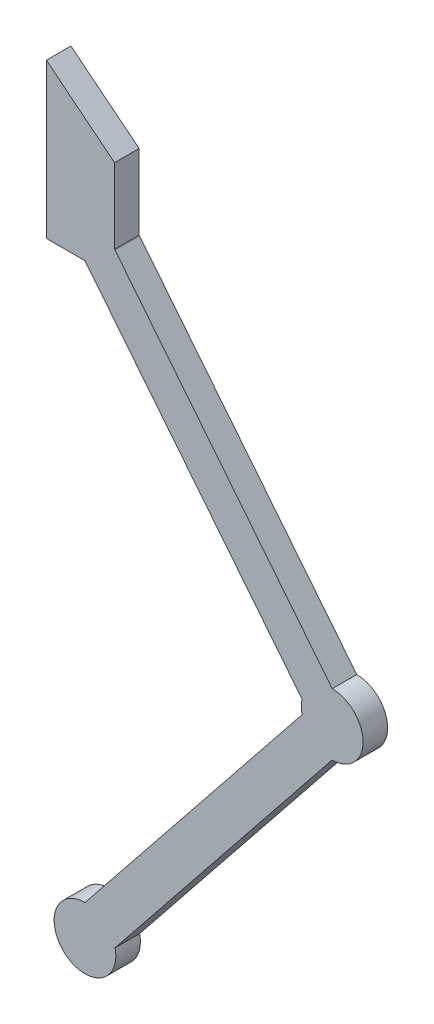
ISO-10303-21;
HEADER;
FILE_DESCRIPTION(('STEP AP214'),'2;1');
FILE_NAME('part.step','',(''),(''),'','','');
FILE_SCHEMA(('AUTOMOTIVE_DESIGN { 1 0 10303 214 1 1 1 1 }'));
ENDSEC;
DATA;
#1=APPLICATION_CONTEXT('core data for automotive mechanical design processes');
#2=APPLICATION_PROTOCOL_DEFINITION('international standard','automotive_design',2000,#1);
#3=PRODUCT_CONTEXT('',#1,'mechanical');
#4=PRODUCT('Part','Part','',(#3));
#5=PRODUCT_RELATED_PRODUCT_CATEGORY('part','',(#4));
#6=PRODUCT_DEFINITION_FORMATION('','',#4);
#7=PRODUCT_DEFINITION_CONTEXT('part definition',#1,'design');
#8=PRODUCT_DEFINITION('design','',#6,#7);
#9=PRODUCT_DEFINITION_SHAPE('','',#8);
#10=(LENGTH_UNIT() NAMED_UNIT(*) SI_UNIT(.MILLI.,.METRE.));
#11=(NAMED_UNIT(*) PLANE_ANGLE_UNIT() SI_UNIT($,.RADIAN.));
#12=(NAMED_UNIT(*) SI_UNIT($,.STERADIAN.) SOLID_ANGLE_UNIT());
#13=UNCERTAINTY_MEASURE_WITH_UNIT(LENGTH_MEASURE(1.E-05),#10,'distance_accuracy_value','');
#14=(GEOMETRIC_REPRESENTATION_CONTEXT(3) GLOBAL_UNCERTAINTY_ASSIGNED_CONTEXT((#13)) GLOBAL_UNIT_ASSIGNED_CONTEXT((#10,
#11,#12)) REPRESENTATION_CONTEXT('',''));
#15=CARTESIAN_POINT('',(0.,0.,0.));
#16=DIRECTION('',(0.,0.,1.));
#17=DIRECTION('',(1.,0.,0.));
#18=AXIS2_PLACEMENT_3D('',#15,#16,#17);
#19=CARTESIAN_POINT('',(-5.,96.0062274819819,3.18));
#20=DIRECTION('',(-0.625,-0.7806247497998,0.));
#21=DIRECTION('',(0.7806247497998,-0.625,0.));
#22=AXIS2_PLACEMENT_3D('',#19,#20,#21);
#23=PLANE('',#22);
#24=DIRECTION('',(-0.7806247497998,0.625,0.));
#25=VECTOR('',#24,1.);
#26=CARTESIAN_POINT('',(-5.,96.0062274819819,0.));
#27=LINE('',#26,#25);
#28=CARTESIAN_POINT('',(3.83821895174355,88.9299890636428,0.));
#29=VERTEX_POINT('',#28);
#30=CARTESIAN_POINT('',(-5.,96.0062274819819,0.));
#31=VERTEX_POINT('',#30);
#32=EDGE_CURVE('E153',#29,#31,#27,.T.);
#33=ORIENTED_EDGE('',*,*,#32,.T.);
#34=DIRECTION('',(0.,0.,-1.));
#35=VECTOR('',#34,1.);
#36=CARTESIAN_POINT('',(-5.,96.0062274819819,3.18));
#37=LINE('',#36,#35);
#38=CARTESIAN_POINT('',(-5.,96.0062274819819,3.18));
#39=VERTEX_POINT('',#38);
#40=EDGE_CURVE('E11',#39,#31,#37,.T.);
#41=ORIENTED_EDGE('',*,*,#40,.F.);
#42=DIRECTION('',(-0.7806247497998,0.625,0.));
#43=VECTOR('',#42,1.);
#44=CARTESIAN_POINT('',(-5.,96.0062274819819,3.18));
#45=LINE('',#44,#43);
#46=CARTESIAN_POINT('',(3.83821895174355,88.9299890636428,3.18));
#47=VERTEX_POINT('',#46);
#48=EDGE_CURVE('E175',#47,#39,#45,.T.);
#49=ORIENTED_EDGE('',*,*,#48,.F.);
#50=DIRECTION('',(0.,0.,-1.));
#51=VECTOR('',#50,1.);
#52=CARTESIAN_POINT('',(3.83821895174355,88.9299890636428,3.18));
#53=LINE('',#52,#51);
#54=EDGE_CURVE('E149',#47,#29,#53,.T.);
#55=ORIENTED_EDGE('',*,*,#54,.T.);
#56=EDGE_LOOP('',(#33,#41,#49,#55));
#57=FACE_BOUND('',#56,.T.);
#58=ADVANCED_FACE('F33',(#57),#23,.F.);
#59=CARTESIAN_POINT('',(-5.,96.0062274819819,3.18));
#60=DIRECTION('',(1.,0.,0.));
#61=DIRECTION('',(0.,0.,-1.));
#62=AXIS2_PLACEMENT_3D('',#59,#60,#61);
#63=PLANE('',#62);
#64=DIRECTION('',(0.,-1.,0.));
#65=VECTOR('',#64,1.);
#66=CARTESIAN_POINT('',(-5.,96.0062274819819,0.));
#67=LINE('',#66,#65);
#68=CARTESIAN_POINT('',(-5.,76.0062274819819,0.));
#69=VERTEX_POINT('',#68);
#70=EDGE_CURVE('E156',#31,#69,#67,.T.);
#71=ORIENTED_EDGE('',*,*,#70,.T.);
#72=DIRECTION('',(0.,0.,-1.));
#73=VECTOR('',#72,1.);
#74=CARTESIAN_POINT('',(-5.,76.0062274819819,3.18));
#75=LINE('',#74,#73);
#76=CARTESIAN_POINT('',(-5.,76.0062274819819,3.18));
#77=VERTEX_POINT('',#76);
#78=EDGE_CURVE('E41',#77,#69,#75,.T.);
#79=ORIENTED_EDGE('',*,*,#78,.F.);
#80=DIRECTION('',(0.,-1.,0.));
#81=VECTOR('',#80,1.);
#82=CARTESIAN_POINT('',(-5.,96.0062274819819,3.18));
#83=LINE('',#82,#81);
#84=EDGE_CURVE('E104',#39,#77,#83,.T.);
#85=ORIENTED_EDGE('',*,*,#84,.F.);
#86=ORIENTED_EDGE('',*,*,#40,.T.);
#87=EDGE_LOOP('',(#71,#79,#85,#86));
#88=FACE_BOUND('',#87,.T.);
#89=ADVANCED_FACE('F253',(#88),#63,.F.);
#90=CARTESIAN_POINT('',(0.,76.0062274819819,3.18));
#91=DIRECTION('',(0.,1.,0.));
#92=DIRECTION('',(0.,0.,1.));
#93=AXIS2_PLACEMENT_3D('',#90,#91,#92);
#94=PLANE('',#93);
#95=DIRECTION('',(1.,0.,0.));
#96=VECTOR('',#95,1.);
#97=CARTESIAN_POINT('',(0.,76.0062274819819,0.));
#98=LINE('',#97,#96);
#99=CARTESIAN_POINT('',(0.,76.0062274819819,0.));
#100=VERTEX_POINT('',#99);
#101=EDGE_CURVE('E158',#69,#100,#98,.T.);
#102=ORIENTED_EDGE('',*,*,#101,.T.);
#103=DIRECTION('',(0.,0.,-1.));
#104=VECTOR('',#103,1.);
#105=CARTESIAN_POINT('',(0.,76.0062274819819,3.18));
#106=LINE('',#105,#104);
#107=CARTESIAN_POINT('',(0.,76.0062274819819,3.18));
#108=VERTEX_POINT('',#107);
#109=EDGE_CURVE('E194',#108,#100,#106,.T.);
#110=ORIENTED_EDGE('',*,*,#109,.F.);
#111=DIRECTION('',(1.,0.,0.));
#112=VECTOR('',#111,1.);
#113=CARTESIAN_POINT('',(0.,76.0062274819819,3.18));
#114=LINE('',#113,#112);
#115=EDGE_CURVE('E202',#77,#108,#114,.T.);
#116=ORIENTED_EDGE('',*,*,#115,.F.);
#117=ORIENTED_EDGE('',*,*,#78,.T.);
#118=EDGE_LOOP('',(#102,#110,#116,#117));
#119=FACE_BOUND('',#118,.T.);
#120=ADVANCED_FACE('F200',(#119),#94,.F.);
#121=CARTESIAN_POINT('',(28.125,40.878113740991,3.18));
#122=DIRECTION('',(0.780624749799798,0.625000000000002,0.));
#123=DIRECTION('',(-0.625000000000002,0.780624749799798,0.));
#124=AXIS2_PLACEMENT_3D('',#121,#122,#123);
#125=PLANE('',#124);
#126=DIRECTION('',(0.625000000000002,-0.780624749799798,0.));
#127=VECTOR('',#126,1.);
#128=CARTESIAN_POINT('',(28.125,40.878113740991,0.));
#129=LINE('',#128,#127);
#130=CARTESIAN_POINT('',(28.125,40.878113740991,0.));
#131=VERTEX_POINT('',#130);
#132=EDGE_CURVE('E160',#100,#131,#129,.T.);
#133=ORIENTED_EDGE('',*,*,#132,.T.);
#134=DIRECTION('',(0.,0.,-1.));
#135=VECTOR('',#134,1.);
#136=CARTESIAN_POINT('',(28.125,40.878113740991,3.18));
#137=LINE('',#136,#135);
#138=CARTESIAN_POINT('',(28.125,40.878113740991,3.18));
#139=VERTEX_POINT('',#138);
#140=EDGE_CURVE('E191',#139,#131,#137,.T.);
#141=ORIENTED_EDGE('',*,*,#140,.F.);
#142=DIRECTION('',(0.625000000000002,-0.780624749799798,0.));
#143=VECTOR('',#142,1.);
#144=CARTESIAN_POINT('',(28.125,40.878113740991,3.18));
#145=LINE('',#144,#143);
#146=EDGE_CURVE('E220',#108,#139,#145,.T.);
#147=ORIENTED_EDGE('',*,*,#146,.F.);
#148=ORIENTED_EDGE('',*,*,#109,.T.);
#149=EDGE_LOOP('',(#133,#141,#147,#148));
#150=FACE_BOUND('',#149,.T.);
#151=ADVANCED_FACE('F211',(#150),#125,.F.);
#152=CARTESIAN_POINT('',(32.028123748999,40.003113740991,3.18));
#153=DIRECTION('',(0.,0.,-1.));
#154=DIRECTION('',(-1.,0.,0.));
#155=AXIS2_PLACEMENT_3D('',#152,#153,#154);
#156=CYLINDRICAL_SURFACE('',#155,4.00000000000002);
#157=CARTESIAN_POINT('',(32.028123748999,40.003113740991,0.));
#158=DIRECTION('',(0.,0.,1.));
#159=DIRECTION('',(-1.,0.,0.));
#160=AXIS2_PLACEMENT_3D('',#157,#158,#159);
#161=CIRCLE('',#160,4.00000000000002);
#162=CARTESIAN_POINT('',(28.125,39.128113740991,0.));
#163=VERTEX_POINT('',#162);
#164=EDGE_CURVE('E162',#131,#163,#161,.T.);
#165=ORIENTED_EDGE('',*,*,#164,.T.);
#166=DIRECTION('',(0.,0.,-1.));
#167=VECTOR('',#166,1.);
#168=CARTESIAN_POINT('',(28.125,39.128113740991,3.18));
#169=LINE('',#168,#167);
#170=CARTESIAN_POINT('',(28.125,39.128113740991,3.18));
#171=VERTEX_POINT('',#170);
#172=EDGE_CURVE('E188',#171,#163,#169,.T.);
#173=ORIENTED_EDGE('',*,*,#172,.F.);
#174=CARTESIAN_POINT('',(32.028123748999,40.003113740991,3.18));
#175=DIRECTION('',(0.,0.,1.));
#176=DIRECTION('',(-1.,0.,0.));
#177=AXIS2_PLACEMENT_3D('',#174,#175,#176);
#178=CIRCLE('',#177,4.00000000000002);
#179=EDGE_CURVE('E217',#139,#171,#178,.T.);
#180=ORIENTED_EDGE('',*,*,#179,.F.);
#181=ORIENTED_EDGE('',*,*,#140,.T.);
#182=EDGE_LOOP('',(#165,#173,#180,#181));
#183=FACE_BOUND('',#182,.T.);
#184=ADVANCED_FACE('F215',(#183),#156,.T.);
#185=CARTESIAN_POINT('',(0.,4.,3.18));
#186=DIRECTION('',(0.7806247497998,-0.625,0.));
#187=DIRECTION('',(0.625,0.7806247497998,0.));
#188=AXIS2_PLACEMENT_3D('',#185,#186,#187);
#189=PLANE('',#188);
#190=DIRECTION('',(-0.625,-0.7806247497998,0.));
#191=VECTOR('',#190,1.);
#192=CARTESIAN_POINT('',(0.,4.,0.));
#193=LINE('',#192,#191);
#194=CARTESIAN_POINT('',(0.,4.,0.));
#195=VERTEX_POINT('',#194);
#196=EDGE_CURVE('E164',#163,#195,#193,.T.);
#197=ORIENTED_EDGE('',*,*,#196,.T.);
#198=DIRECTION('',(0.,0.,-1.));
#199=VECTOR('',#198,1.);
#200=CARTESIAN_POINT('',(0.,4.,3.18));
#201=LINE('',#200,#199);
#202=CARTESIAN_POINT('',(0.,4.,3.18));
#203=VERTEX_POINT('',#202);
#204=EDGE_CURVE('E185',#203,#195,#201,.T.);
#205=ORIENTED_EDGE('',*,*,#204,.F.);
#206=DIRECTION('',(-0.625,-0.7806247497998,0.));
#207=VECTOR('',#206,1.);
#208=CARTESIAN_POINT('',(0.,4.,3.18));
#209=LINE('',#208,#207);
#210=EDGE_CURVE('E219',#171,#203,#209,.T.);
#211=ORIENTED_EDGE('',*,*,#210,.F.);
#212=ORIENTED_EDGE('',*,*,#172,.T.);
#213=EDGE_LOOP('',(#197,#205,#211,#212));
#214=FACE_BOUND('',#213,.T.);
#215=ADVANCED_FACE('F266',(#214),#189,.F.);
#216=CARTESIAN_POINT('',(0.,0.,3.18));
#217=DIRECTION('',(0.,0.,-1.));
#218=DIRECTION('',(-1.,0.,0.));
#219=AXIS2_PLACEMENT_3D('',#216,#217,#218);
#220=CYLINDRICAL_SURFACE('',#219,4.);
#221=CARTESIAN_POINT('',(0.,0.,0.));
#222=DIRECTION('',(0.,0.,1.));
#223=DIRECTION('',(1.,0.,0.));
#224=AXIS2_PLACEMENT_3D('',#221,#222,#223);
#225=CIRCLE('',#224,4.);
#226=CARTESIAN_POINT('',(3.903123748999,0.875000000000002,0.));
#227=VERTEX_POINT('',#226);
#228=EDGE_CURVE('E166',#195,#227,#225,.T.);
#229=ORIENTED_EDGE('',*,*,#228,.T.);
#230=DIRECTION('',(0.,0.,-1.));
#231=VECTOR('',#230,1.);
#232=CARTESIAN_POINT('',(3.903123748999,0.875000000000002,3.18));
#233=LINE('',#232,#231);
#234=CARTESIAN_POINT('',(3.903123748999,0.875000000000002,3.18));
#235=VERTEX_POINT('',#234);
#236=EDGE_CURVE('E182',#235,#227,#233,.T.);
#237=ORIENTED_EDGE('',*,*,#236,.F.);
#238=CARTESIAN_POINT('',(0.,0.,3.18));
#239=DIRECTION('',(0.,0.,1.));
#240=DIRECTION('',(1.,0.,0.));
#241=AXIS2_PLACEMENT_3D('',#238,#239,#240);
#242=CIRCLE('',#241,4.);
#243=EDGE_CURVE('E222',#203,#235,#242,.T.);
#244=ORIENTED_EDGE('',*,*,#243,.F.);
#245=ORIENTED_EDGE('',*,*,#204,.T.);
#246=EDGE_LOOP('',(#229,#237,#244,#245));
#247=FACE_BOUND('',#246,.T.);
#248=ADVANCED_FACE('F269',(#247),#220,.T.);
#249=CARTESIAN_POINT('',(3.903123748999,0.875000000000001,3.18));
#250=DIRECTION('',(-0.7806247497998,0.625,0.));
#251=DIRECTION('',(-0.625,-0.7806247497998,0.));
#252=AXIS2_PLACEMENT_3D('',#249,#250,#251);
#253=PLANE('',#252);
#254=DIRECTION('',(0.625,0.7806247497998,0.));
#255=VECTOR('',#254,1.);
#256=CARTESIAN_POINT('',(3.903123748999,0.875000000000001,0.));
#257=LINE('',#256,#255);
#258=CARTESIAN_POINT('',(32.028123748999,36.003113740991,0.));
#259=VERTEX_POINT('',#258);
#260=EDGE_CURVE('E168',#227,#259,#257,.T.);
#261=ORIENTED_EDGE('',*,*,#260,.T.);
#262=DIRECTION('',(0.,0.,-1.));
#263=VECTOR('',#262,1.);
#264=CARTESIAN_POINT('',(32.028123748999,36.003113740991,3.18));
#265=LINE('',#264,#263);
#266=CARTESIAN_POINT('',(32.028123748999,36.003113740991,3.18));
#267=VERTEX_POINT('',#266);
#268=EDGE_CURVE('E179',#267,#259,#265,.T.);
#269=ORIENTED_EDGE('',*,*,#268,.F.);
#270=DIRECTION('',(0.625,0.7806247497998,0.));
#271=VECTOR('',#270,1.);
#272=CARTESIAN_POINT('',(3.903123748999,0.875000000000001,3.18));
#273=LINE('',#272,#271);
#274=EDGE_CURVE('E228',#235,#267,#273,.T.);
#275=ORIENTED_EDGE('',*,*,#274,.F.);
#276=ORIENTED_EDGE('',*,*,#236,.T.);
#277=EDGE_LOOP('',(#261,#269,#275,#276));
#278=FACE_BOUND('',#277,.T.);
#279=ADVANCED_FACE('F234',(#278),#253,.F.);
#280=CARTESIAN_POINT('',(32.028123748999,40.003113740991,3.18));
#281=DIRECTION('',(0.,0.,-1.));
#282=DIRECTION('',(-1.,0.,0.));
#283=AXIS2_PLACEMENT_3D('',#280,#281,#282);
#284=CYLINDRICAL_SURFACE('',#283,3.99999999999999);
#285=CARTESIAN_POINT('',(32.028123748999,40.003113740991,0.));
#286=DIRECTION('',(0.,0.,1.));
#287=DIRECTION('',(1.,0.,0.));
#288=AXIS2_PLACEMENT_3D('',#285,#286,#287);
#289=CIRCLE('',#288,3.99999999999999);
#290=CARTESIAN_POINT('',(32.028123748999,44.003113740991,0.));
#291=VERTEX_POINT('',#290);
#292=EDGE_CURVE('E170',#259,#291,#289,.T.);
#293=ORIENTED_EDGE('',*,*,#292,.T.);
#294=DIRECTION('',(0.,0.,-1.));
#295=VECTOR('',#294,1.);
#296=CARTESIAN_POINT('',(32.028123748999,44.003113740991,3.18));
#297=LINE('',#296,#295);
#298=CARTESIAN_POINT('',(32.028123748999,44.003113740991,3.18));
#299=VERTEX_POINT('',#298);
#300=EDGE_CURVE('E144',#299,#291,#297,.T.);
#301=ORIENTED_EDGE('',*,*,#300,.F.);
#302=CARTESIAN_POINT('',(32.028123748999,40.003113740991,3.18));
#303=DIRECTION('',(0.,0.,1.));
#304=DIRECTION('',(1.,0.,0.));
#305=AXIS2_PLACEMENT_3D('',#302,#303,#304);
#306=CIRCLE('',#305,3.99999999999999);
#307=EDGE_CURVE('E135',#267,#299,#306,.T.);
#308=ORIENTED_EDGE('',*,*,#307,.F.);
#309=ORIENTED_EDGE('',*,*,#268,.T.);
#310=EDGE_LOOP('',(#293,#301,#308,#309));
#311=FACE_BOUND('',#310,.T.);
#312=ADVANCED_FACE('F238',(#311),#284,.T.);
#313=CARTESIAN_POINT('',(32.028123748999,44.003113740991,3.18));
#314=DIRECTION('',(-0.780624749799801,-0.624999999999999,0.));
#315=DIRECTION('',(0.624999999999999,-0.780624749799801,0.));
#316=AXIS2_PLACEMENT_3D('',#313,#314,#315);
#317=PLANE('',#316);
#318=DIRECTION('',(-0.624999999999999,0.780624749799801,0.));
#319=VECTOR('',#318,1.);
#320=CARTESIAN_POINT('',(32.028123748999,44.003113740991,0.));
#321=LINE('',#320,#319);
#322=CARTESIAN_POINT('',(3.90312374899906,79.131227481982,0.));
#323=VERTEX_POINT('',#322);
#324=EDGE_CURVE('E143',#291,#323,#321,.T.);
#325=ORIENTED_EDGE('',*,*,#324,.T.);
#326=DIRECTION('',(0.,0.,-1.));
#327=VECTOR('',#326,1.);
#328=CARTESIAN_POINT('',(3.90312374899906,79.131227481982,3.18));
#329=LINE('',#328,#327);
#330=CARTESIAN_POINT('',(3.90312374899906,79.131227481982,3.18));
#331=VERTEX_POINT('',#330);
#332=EDGE_CURVE('E140',#331,#323,#329,.T.);
#333=ORIENTED_EDGE('',*,*,#332,.F.);
#334=DIRECTION('',(-0.624999999999999,0.780624749799801,0.));
#335=VECTOR('',#334,1.);
#336=CARTESIAN_POINT('',(32.028123748999,44.003113740991,3.18));
#337=LINE('',#336,#335);
#338=EDGE_CURVE('E129',#299,#331,#337,.T.);
#339=ORIENTED_EDGE('',*,*,#338,.F.);
#340=ORIENTED_EDGE('',*,*,#300,.T.);
#341=EDGE_LOOP('',(#325,#333,#339,#340));
#342=FACE_BOUND('',#341,.T.);
#343=ADVANCED_FACE('F141',(#342),#317,.F.);
#344=CARTESIAN_POINT('',(3.90312374899906,79.131227481982,3.18));
#345=DIRECTION('',(-0.760747480654599,-0.649047972554942,0.));
#346=DIRECTION('',(0.649047972554942,-0.760747480654599,0.));
#347=AXIS2_PLACEMENT_3D('',#344,#345,#346);
#348=PLANE('',#347);
#349=DIRECTION('',(-0.649047972554942,0.760747480654599,0.));
#350=VECTOR('',#349,1.);
#351=CARTESIAN_POINT('',(3.90312374899906,79.131227481982,0.));
#352=LINE('',#351,#350);
#353=CARTESIAN_POINT('',(3.83821895174355,79.2073022300475,0.));
#354=VERTEX_POINT('',#353);
#355=EDGE_CURVE('E90',#323,#354,#352,.T.);
#356=ORIENTED_EDGE('',*,*,#355,.T.);
#357=DIRECTION('',(0.,0.,-1.));
#358=VECTOR('',#357,1.);
#359=CARTESIAN_POINT('',(3.83821895174355,79.2073022300475,3.18));
#360=LINE('',#359,#358);
#361=CARTESIAN_POINT('',(3.83821895174355,79.2073022300475,3.18));
#362=VERTEX_POINT('',#361);
#363=EDGE_CURVE('E145',#362,#354,#360,.T.);
#364=ORIENTED_EDGE('',*,*,#363,.F.);
#365=DIRECTION('',(-0.649047972554942,0.760747480654599,0.));
#366=VECTOR('',#365,1.);
#367=CARTESIAN_POINT('',(3.90312374899906,79.131227481982,3.18));
#368=LINE('',#367,#366);
#369=EDGE_CURVE('E133',#331,#362,#368,.T.);
#370=ORIENTED_EDGE('',*,*,#369,.F.);
#371=ORIENTED_EDGE('',*,*,#332,.T.);
#372=EDGE_LOOP('',(#356,#364,#370,#371));
#373=FACE_BOUND('',#372,.T.);
#374=ADVANCED_FACE('F147',(#373),#348,.F.);
#375=CARTESIAN_POINT('',(3.83821895174355,88.9299890636428,3.18));
#376=DIRECTION('',(-1.,0.,0.));
#377=DIRECTION('',(0.,-1.,0.));
#378=AXIS2_PLACEMENT_3D('',#375,#376,#377);
#379=PLANE('',#378);
#380=DIRECTION('',(0.,1.,0.));
#381=VECTOR('',#380,1.);
#382=CARTESIAN_POINT('',(3.83821895174355,88.9299890636428,0.));
#383=LINE('',#382,#381);
#384=EDGE_CURVE('E96',#354,#29,#383,.T.);
#385=ORIENTED_EDGE('',*,*,#384,.T.);
#386=ORIENTED_EDGE('',*,*,#54,.F.);
#387=DIRECTION('',(0.,1.,0.));
#388=VECTOR('',#387,1.);
#389=CARTESIAN_POINT('',(3.83821895174355,88.9299890636428,3.18));
#390=LINE('',#389,#388);
#391=EDGE_CURVE('E49',#362,#47,#390,.T.);
#392=ORIENTED_EDGE('',*,*,#391,.F.);
#393=ORIENTED_EDGE('',*,*,#363,.T.);
#394=EDGE_LOOP('',(#385,#386,#392,#393));
#395=FACE_BOUND('',#394,.T.);
#396=ADVANCED_FACE('F242',(#395),#379,.F.);
#397=CARTESIAN_POINT('',(32.028123748999,40.003113740991,3.18));
#398=DIRECTION('',(0.,0.,1.));
#399=DIRECTION('',(1.,0.,0.));
#400=AXIS2_PLACEMENT_3D('',#397,#398,#399);
#401=PLANE('',#400);
#402=ORIENTED_EDGE('',*,*,#48,.T.);
#403=ORIENTED_EDGE('',*,*,#84,.T.);
#404=ORIENTED_EDGE('',*,*,#115,.T.);
#405=ORIENTED_EDGE('',*,*,#146,.T.);
#406=ORIENTED_EDGE('',*,*,#179,.T.);
#407=ORIENTED_EDGE('',*,*,#210,.T.);
#408=ORIENTED_EDGE('',*,*,#243,.T.);
#409=ORIENTED_EDGE('',*,*,#274,.T.);
#410=ORIENTED_EDGE('',*,*,#307,.T.);
#411=ORIENTED_EDGE('',*,*,#338,.T.);
#412=ORIENTED_EDGE('',*,*,#369,.T.);
#413=ORIENTED_EDGE('',*,*,#391,.T.);
#414=EDGE_LOOP('',(#402,#403,#404,#405,#406,#407,#408,#409,#410,#411,#412,#413));
#415=FACE_BOUND('',#414,.T.);
#416=ADVANCED_FACE('F131',(#415),#401,.T.);
#417=CARTESIAN_POINT('',(32.028123748999,40.003113740991,0.));
#418=DIRECTION('',(0.,0.,1.));
#419=DIRECTION('',(1.,0.,0.));
#420=AXIS2_PLACEMENT_3D('',#417,#418,#419);
#421=PLANE('',#420);
#422=ORIENTED_EDGE('',*,*,#32,.F.);
#423=ORIENTED_EDGE('',*,*,#384,.F.);
#424=ORIENTED_EDGE('',*,*,#355,.F.);
#425=ORIENTED_EDGE('',*,*,#324,.F.);
#426=ORIENTED_EDGE('',*,*,#292,.F.);
#427=ORIENTED_EDGE('',*,*,#260,.F.);
#428=ORIENTED_EDGE('',*,*,#228,.F.);
#429=ORIENTED_EDGE('',*,*,#196,.F.);
#430=ORIENTED_EDGE('',*,*,#164,.F.);
#431=ORIENTED_EDGE('',*,*,#132,.F.);
#432=ORIENTED_EDGE('',*,*,#101,.F.);
#433=ORIENTED_EDGE('',*,*,#70,.F.);
#434=EDGE_LOOP('',(#422,#423,#424,#425,#426,#427,#428,#429,#430,#431,#432,#433));
#435=FACE_BOUND('',#434,.T.);
#436=ADVANCED_FACE('F206',(#435),#421,.F.);
#437=CLOSED_SHELL('',(#58,#89,#120,#151,#184,#215,#248,#279,#312,#343,#374,#396,#416,#436));
#438=MANIFOLD_SOLID_BREP('B2',#437);
#439=ADVANCED_BREP_SHAPE_REPRESENTATION('',(#18,#438),#14);
#440=SHAPE_DEFINITION_REPRESENTATION(#9,#439);
ENDSEC;
END-ISO-10303-21;
